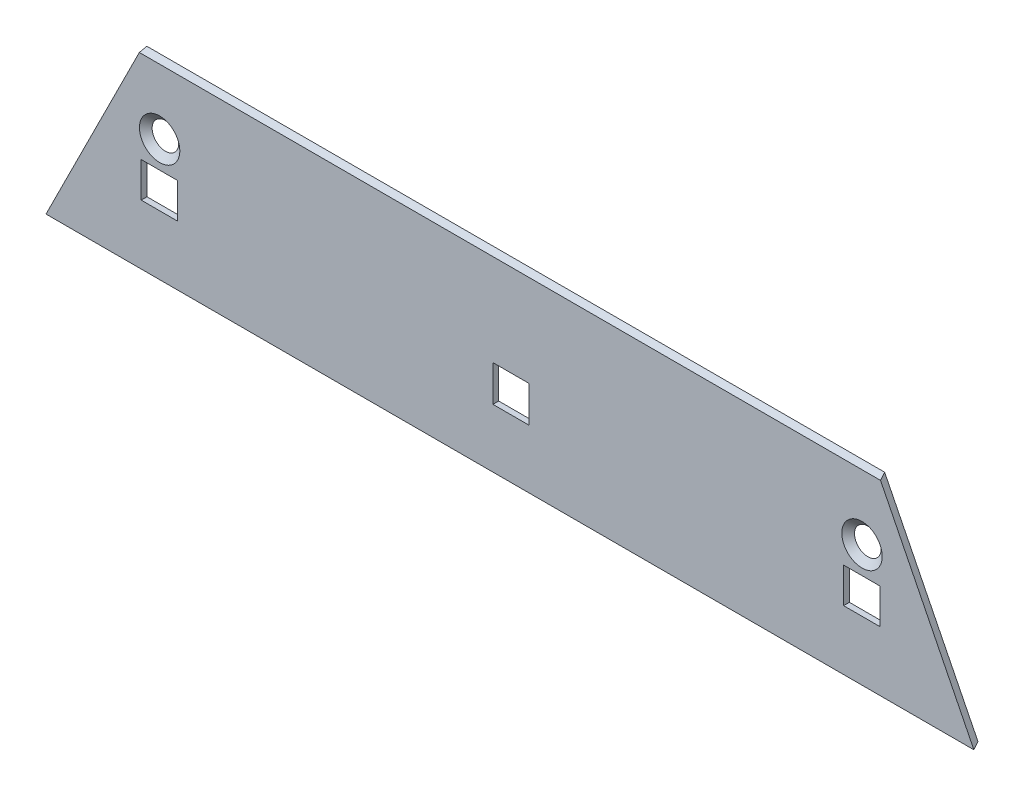
ISO-10303-21;
HEADER;
FILE_DESCRIPTION(('STEP AP214'),'2;1');
FILE_NAME('part.step','',(''),(''),'','','');
FILE_SCHEMA(('AUTOMOTIVE_DESIGN { 1 0 10303 214 1 1 1 1 }'));
ENDSEC;
DATA;
#1=APPLICATION_CONTEXT('core data for automotive mechanical design processes');
#2=APPLICATION_PROTOCOL_DEFINITION('international standard','automotive_design',2000,#1);
#3=PRODUCT_CONTEXT('',#1,'mechanical');
#4=PRODUCT('Part','Part','',(#3));
#5=PRODUCT_RELATED_PRODUCT_CATEGORY('part','',(#4));
#6=PRODUCT_DEFINITION_FORMATION('','',#4);
#7=PRODUCT_DEFINITION_CONTEXT('part definition',#1,'design');
#8=PRODUCT_DEFINITION('design','',#6,#7);
#9=PRODUCT_DEFINITION_SHAPE('','',#8);
#10=(LENGTH_UNIT() NAMED_UNIT(*) SI_UNIT(.MILLI.,.METRE.));
#11=(NAMED_UNIT(*) PLANE_ANGLE_UNIT() SI_UNIT($,.RADIAN.));
#12=(NAMED_UNIT(*) SI_UNIT($,.STERADIAN.) SOLID_ANGLE_UNIT());
#13=UNCERTAINTY_MEASURE_WITH_UNIT(LENGTH_MEASURE(1.E-05),#10,'distance_accuracy_value','');
#14=(GEOMETRIC_REPRESENTATION_CONTEXT(3) GLOBAL_UNCERTAINTY_ASSIGNED_CONTEXT((#13)) GLOBAL_UNIT_ASSIGNED_CONTEXT((#10,
#11,#12)) REPRESENTATION_CONTEXT('',''));
#15=CARTESIAN_POINT('',(0.,0.,0.));
#16=DIRECTION('',(0.,0.,1.));
#17=DIRECTION('',(1.,0.,0.));
#18=AXIS2_PLACEMENT_3D('',#15,#16,#17);
#19=CARTESIAN_POINT('',(162.814,-1.33086780534522,0.5715));
#20=DIRECTION('',(0.,0.,1.));
#21=DIRECTION('',(1.,0.,0.));
#22=AXIS2_PLACEMENT_3D('',#19,#20,#21);
#23=PLANE('',#22);
#24=CARTESIAN_POINT('',(19.9389999999997,19.426957216481,0.5715));
#25=DIRECTION('',(0.,0.,1.));
#26=DIRECTION('',(1.,0.,0.));
#27=AXIS2_PLACEMENT_3D('',#24,#25,#26);
#28=CIRCLE('',#27,2.33247834992428);
#29=CARTESIAN_POINT('',(22.271478349924,19.426957216481,0.5715));
#30=VERTEX_POINT('',#29);
#31=EDGE_CURVE('E314',#30,#30,#28,.T.);
#32=ORIENTED_EDGE('',*,*,#31,.T.);
#33=EDGE_LOOP('',(#32));
#34=FACE_BOUND('',#33,.T.);
#35=CARTESIAN_POINT('',(143.187406325167,19.426957216481,0.5715));
#36=DIRECTION('',(0.,0.,1.));
#37=DIRECTION('',(1.,0.,0.));
#38=AXIS2_PLACEMENT_3D('',#35,#36,#37);
#39=CIRCLE('',#38,2.33247834992428);
#40=CARTESIAN_POINT('',(145.519884675091,19.426957216481,0.5715));
#41=VERTEX_POINT('',#40);
#42=EDGE_CURVE('E168',#41,#41,#39,.T.);
#43=ORIENTED_EDGE('',*,*,#42,.T.);
#44=EDGE_LOOP('',(#43));
#45=FACE_BOUND('',#44,.T.);
#46=DIRECTION('',(-1.,0.,0.));
#47=VECTOR('',#46,1.);
#48=CARTESIAN_POINT('',(78.4186968374164,14.7279572164811,0.5715));
#49=LINE('',#48,#47);
#50=CARTESIAN_POINT('',(84.7686968374164,14.7279572164811,0.5715));
#51=VERTEX_POINT('',#50);
#52=CARTESIAN_POINT('',(78.4186968374164,14.7279572164811,0.5715));
#53=VERTEX_POINT('',#52);
#54=EDGE_CURVE('E153',#51,#53,#49,.T.);
#55=ORIENTED_EDGE('',*,*,#54,.T.);
#56=DIRECTION('',(0.,-1.,0.));
#57=VECTOR('',#56,1.);
#58=CARTESIAN_POINT('',(78.4186968374164,14.7279572164811,0.5715));
#59=LINE('',#58,#57);
#60=CARTESIAN_POINT('',(78.4186968374164,8.37795721648112,0.5715));
#61=VERTEX_POINT('',#60);
#62=EDGE_CURVE('E147',#53,#61,#59,.T.);
#63=ORIENTED_EDGE('',*,*,#62,.T.);
#64=DIRECTION('',(1.,0.,0.));
#65=VECTOR('',#64,1.);
#66=CARTESIAN_POINT('',(78.4186968374164,8.37795721648112,0.5715));
#67=LINE('',#66,#65);
#68=CARTESIAN_POINT('',(84.7686968374164,8.37795721648111,0.5715));
#69=VERTEX_POINT('',#68);
#70=EDGE_CURVE('E156',#61,#69,#67,.T.);
#71=ORIENTED_EDGE('',*,*,#70,.T.);
#72=DIRECTION('',(0.,1.,0.));
#73=VECTOR('',#72,1.);
#74=CARTESIAN_POINT('',(84.7686968374164,14.7279572164811,0.5715));
#75=LINE('',#74,#73);
#76=EDGE_CURVE('E48',#69,#51,#75,.T.);
#77=ORIENTED_EDGE('',*,*,#76,.T.);
#78=EDGE_LOOP('',(#55,#63,#71,#77));
#79=FACE_BOUND('',#78,.T.);
#80=DIRECTION('',(-1.,0.,0.));
#81=VECTOR('',#80,1.);
#82=CARTESIAN_POINT('',(139.954,14.7279572164811,0.5715));
#83=LINE('',#82,#81);
#84=CARTESIAN_POINT('',(146.304,14.7279572164811,0.5715));
#85=VERTEX_POINT('',#84);
#86=CARTESIAN_POINT('',(139.954,14.7279572164811,0.5715));
#87=VERTEX_POINT('',#86);
#88=EDGE_CURVE('E194',#85,#87,#83,.T.);
#89=ORIENTED_EDGE('',*,*,#88,.T.);
#90=DIRECTION('',(0.,-1.,0.));
#91=VECTOR('',#90,1.);
#92=CARTESIAN_POINT('',(139.954,14.7279572164811,0.5715));
#93=LINE('',#92,#91);
#94=CARTESIAN_POINT('',(139.954,8.55575721648109,0.5715));
#95=VERTEX_POINT('',#94);
#96=EDGE_CURVE('E184',#87,#95,#93,.T.);
#97=ORIENTED_EDGE('',*,*,#96,.T.);
#98=DIRECTION('',(1.,0.,0.));
#99=VECTOR('',#98,1.);
#100=CARTESIAN_POINT('',(139.954,8.55575721648109,0.5715));
#101=LINE('',#100,#99);
#102=CARTESIAN_POINT('',(146.304,8.55575721648109,0.5715));
#103=VERTEX_POINT('',#102);
#104=EDGE_CURVE('E187',#95,#103,#101,.T.);
#105=ORIENTED_EDGE('',*,*,#104,.T.);
#106=DIRECTION('',(0.,1.,0.));
#107=VECTOR('',#106,1.);
#108=CARTESIAN_POINT('',(146.304,14.7279572164811,0.5715));
#109=LINE('',#108,#107);
#110=EDGE_CURVE('E191',#103,#85,#109,.T.);
#111=ORIENTED_EDGE('',*,*,#110,.T.);
#112=EDGE_LOOP('',(#89,#97,#105,#111));
#113=FACE_BOUND('',#112,.T.);
#114=DIRECTION('',(-1.,0.,0.));
#115=VECTOR('',#114,1.);
#116=CARTESIAN_POINT('',(16.705593674833,14.7279572164811,0.5715));
#117=LINE('',#116,#115);
#118=CARTESIAN_POINT('',(23.055593674833,14.7279572164811,0.5715));
#119=VERTEX_POINT('',#118);
#120=CARTESIAN_POINT('',(16.705593674833,14.7279572164811,0.5715));
#121=VERTEX_POINT('',#120);
#122=EDGE_CURVE('E226',#119,#121,#117,.T.);
#123=ORIENTED_EDGE('',*,*,#122,.T.);
#124=DIRECTION('',(0.,-1.,0.));
#125=VECTOR('',#124,1.);
#126=CARTESIAN_POINT('',(16.705593674833,14.7279572164811,0.5715));
#127=LINE('',#126,#125);
#128=CARTESIAN_POINT('',(16.705593674833,8.55575721648113,0.5715));
#129=VERTEX_POINT('',#128);
#130=EDGE_CURVE('E216',#121,#129,#127,.T.);
#131=ORIENTED_EDGE('',*,*,#130,.T.);
#132=DIRECTION('',(1.,0.,0.));
#133=VECTOR('',#132,1.);
#134=CARTESIAN_POINT('',(16.705593674833,8.55575721648113,0.5715));
#135=LINE('',#134,#133);
#136=CARTESIAN_POINT('',(23.055593674833,8.55575721648113,0.5715));
#137=VERTEX_POINT('',#136);
#138=EDGE_CURVE('E219',#129,#137,#135,.T.);
#139=ORIENTED_EDGE('',*,*,#138,.T.);
#140=DIRECTION('',(0.,1.,0.));
#141=VECTOR('',#140,1.);
#142=CARTESIAN_POINT('',(23.055593674833,14.7279572164811,0.5715));
#143=LINE('',#142,#141);
#144=EDGE_CURVE('E223',#137,#119,#143,.T.);
#145=ORIENTED_EDGE('',*,*,#144,.T.);
#146=EDGE_LOOP('',(#123,#131,#139,#145));
#147=FACE_BOUND('',#146,.T.);
#148=DIRECTION('',(-1.,0.,0.));
#149=VECTOR('',#148,1.);
#150=CARTESIAN_POINT('',(162.814,31.4200443211581,0.5715));
#151=LINE('',#150,#149);
#152=CARTESIAN_POINT('',(146.141650509094,31.4200443211581,0.5715));
#153=VERTEX_POINT('',#152);
#154=CARTESIAN_POINT('',(16.6723494909062,31.4200443211581,0.5715));
#155=VERTEX_POINT('',#154);
#156=EDGE_CURVE('E11',#153,#155,#151,.T.);
#157=ORIENTED_EDGE('',*,*,#156,.F.);
#158=DIRECTION('',(0.447290848418704,-0.894388560370086,0.));
#159=VECTOR('',#158,1.);
#160=CARTESIAN_POINT('',(162.814,-1.91745567884188,0.5715));
#161=LINE('',#160,#159);
#162=CARTESIAN_POINT('',(162.520642728637,-1.33086780534522,0.5715));
#163=VERTEX_POINT('',#162);
#164=EDGE_CURVE('E248',#153,#163,#161,.T.);
#165=ORIENTED_EDGE('',*,*,#164,.T.);
#166=DIRECTION('',(-1.,0.,0.));
#167=VECTOR('',#166,1.);
#168=CARTESIAN_POINT('',(162.814,-1.33086780534522,0.5715));
#169=LINE('',#168,#167);
#170=CARTESIAN_POINT('',(0.293357271362982,-1.33086780534522,0.5715));
#171=VERTEX_POINT('',#170);
#172=EDGE_CURVE('E270',#163,#171,#169,.T.);
#173=ORIENTED_EDGE('',*,*,#172,.T.);
#174=DIRECTION('',(0.447290848418704,0.894388560370086,0.));
#175=VECTOR('',#174,1.);
#176=CARTESIAN_POINT('',(0.,-1.91745567884188,0.5715));
#177=LINE('',#176,#175);
#178=EDGE_CURVE('E259',#171,#155,#177,.T.);
#179=ORIENTED_EDGE('',*,*,#178,.T.);
#180=EDGE_LOOP('',(#157,#165,#173,#179));
#181=FACE_BOUND('',#180,.T.);
#182=ADVANCED_FACE('F34',(#34,#45,#79,#113,#147,#181),#23,.F.);
#183=CARTESIAN_POINT('',(162.814,31.4200443211581,0.5715));
#184=DIRECTION('',(0.,-0.866025403784435,-0.500000000000006));
#185=DIRECTION('',(0.,0.500000000000006,-0.866025403784435));
#186=AXIS2_PLACEMENT_3D('',#183,#184,#185);
#187=PLANE('',#186);
#188=DIRECTION('',(-1.,0.,0.));
#189=VECTOR('',#188,1.);
#190=CARTESIAN_POINT('',(162.814,30.8334564476615,1.5875));
#191=LINE('',#190,#189);
#192=CARTESIAN_POINT('',(146.435007780457,30.8334564476614,1.5875));
#193=VERTEX_POINT('',#192);
#194=CARTESIAN_POINT('',(16.3789922195432,30.8334564476615,1.5875));
#195=VERTEX_POINT('',#194);
#196=EDGE_CURVE('E41',#193,#195,#191,.T.);
#197=ORIENTED_EDGE('',*,*,#196,.F.);
#198=DIRECTION('',(-0.242584917028732,0.485065087908362,-0.840157377235133));
#199=VECTOR('',#198,1.);
#200=CARTESIAN_POINT('',(147.122775628261,29.4582177244887,3.96948334107133));
#201=LINE('',#200,#199);
#202=EDGE_CURVE('E255',#193,#153,#201,.T.);
#203=ORIENTED_EDGE('',*,*,#202,.T.);
#204=ORIENTED_EDGE('',*,*,#156,.T.);
#205=DIRECTION('',(-0.242584917028732,-0.485065087908362,0.840157377235133));
#206=VECTOR('',#205,1.);
#207=CARTESIAN_POINT('',(25.2724117886163,48.6164554812222,-29.213557837075));
#208=LINE('',#207,#206);
#209=EDGE_CURVE('E267',#155,#195,#208,.T.);
#210=ORIENTED_EDGE('',*,*,#209,.T.);
#211=EDGE_LOOP('',(#197,#203,#204,#210));
#212=FACE_BOUND('',#211,.T.);
#213=ADVANCED_FACE('F285',(#212),#187,.F.);
#214=CARTESIAN_POINT('',(162.814,-1.91745567884188,1.5875));
#215=DIRECTION('',(0.,0.,-1.));
#216=DIRECTION('',(0.,1.,0.));
#217=AXIS2_PLACEMENT_3D('',#214,#215,#216);
#218=PLANE('',#217);
#219=CARTESIAN_POINT('',(19.9389999999997,19.426957216481,1.5875));
#220=DIRECTION('',(0.,0.,1.));
#221=DIRECTION('',(1.,0.,0.));
#222=AXIS2_PLACEMENT_3D('',#219,#220,#221);
#223=CIRCLE('',#222,3.5433);
#224=CARTESIAN_POINT('',(23.4822999999997,19.426957216481,1.5875));
#225=VERTEX_POINT('',#224);
#226=EDGE_CURVE('E322',#225,#225,#223,.T.);
#227=ORIENTED_EDGE('',*,*,#226,.F.);
#228=EDGE_LOOP('',(#227));
#229=FACE_BOUND('',#228,.T.);
#230=CARTESIAN_POINT('',(143.187406325167,19.426957216481,1.5875));
#231=DIRECTION('',(0.,0.,1.));
#232=DIRECTION('',(1.,0.,0.));
#233=AXIS2_PLACEMENT_3D('',#230,#231,#232);
#234=CIRCLE('',#233,3.5433);
#235=CARTESIAN_POINT('',(146.730706325167,19.426957216481,1.5875));
#236=VERTEX_POINT('',#235);
#237=EDGE_CURVE('E318',#236,#236,#234,.T.);
#238=ORIENTED_EDGE('',*,*,#237,.F.);
#239=EDGE_LOOP('',(#238));
#240=FACE_BOUND('',#239,.T.);
#241=DIRECTION('',(1.,0.,0.));
#242=VECTOR('',#241,1.);
#243=CARTESIAN_POINT('',(78.4186968374164,8.37795721648112,1.5875));
#244=LINE('',#243,#242);
#245=CARTESIAN_POINT('',(78.4186968374164,8.37795721648112,1.5875));
#246=VERTEX_POINT('',#245);
#247=CARTESIAN_POINT('',(84.7686968374164,8.37795721648111,1.5875));
#248=VERTEX_POINT('',#247);
#249=EDGE_CURVE('E174',#246,#248,#244,.T.);
#250=ORIENTED_EDGE('',*,*,#249,.F.);
#251=DIRECTION('',(0.,-1.,0.));
#252=VECTOR('',#251,1.);
#253=CARTESIAN_POINT('',(78.4186968374164,14.7279572164811,1.5875));
#254=LINE('',#253,#252);
#255=CARTESIAN_POINT('',(78.4186968374164,14.7279572164811,1.5875));
#256=VERTEX_POINT('',#255);
#257=EDGE_CURVE('E56',#256,#246,#254,.T.);
#258=ORIENTED_EDGE('',*,*,#257,.F.);
#259=DIRECTION('',(-1.,0.,0.));
#260=VECTOR('',#259,1.);
#261=CARTESIAN_POINT('',(78.4186968374164,14.7279572164811,1.5875));
#262=LINE('',#261,#260);
#263=CARTESIAN_POINT('',(84.7686968374164,14.7279572164811,1.5875));
#264=VERTEX_POINT('',#263);
#265=EDGE_CURVE('E162',#264,#256,#262,.T.);
#266=ORIENTED_EDGE('',*,*,#265,.F.);
#267=DIRECTION('',(0.,1.,0.));
#268=VECTOR('',#267,1.);
#269=CARTESIAN_POINT('',(84.7686968374164,14.7279572164811,1.5875));
#270=LINE('',#269,#268);
#271=EDGE_CURVE('E165',#248,#264,#270,.T.);
#272=ORIENTED_EDGE('',*,*,#271,.F.);
#273=EDGE_LOOP('',(#250,#258,#266,#272));
#274=FACE_BOUND('',#273,.T.);
#275=DIRECTION('',(1.,0.,0.));
#276=VECTOR('',#275,1.);
#277=CARTESIAN_POINT('',(139.954,8.55575721648109,1.5875));
#278=LINE('',#277,#276);
#279=CARTESIAN_POINT('',(139.954,8.55575721648109,1.5875));
#280=VERTEX_POINT('',#279);
#281=CARTESIAN_POINT('',(146.304,8.55575721648109,1.5875));
#282=VERTEX_POINT('',#281);
#283=EDGE_CURVE('E199',#280,#282,#278,.T.);
#284=ORIENTED_EDGE('',*,*,#283,.F.);
#285=DIRECTION('',(0.,-1.,0.));
#286=VECTOR('',#285,1.);
#287=CARTESIAN_POINT('',(139.954,14.7279572164811,1.5875));
#288=LINE('',#287,#286);
#289=CARTESIAN_POINT('',(139.954,14.7279572164811,1.5875));
#290=VERTEX_POINT('',#289);
#291=EDGE_CURVE('E180',#290,#280,#288,.T.);
#292=ORIENTED_EDGE('',*,*,#291,.F.);
#293=DIRECTION('',(-1.,0.,0.));
#294=VECTOR('',#293,1.);
#295=CARTESIAN_POINT('',(139.954,14.7279572164811,1.5875));
#296=LINE('',#295,#294);
#297=CARTESIAN_POINT('',(146.304,14.7279572164811,1.5875));
#298=VERTEX_POINT('',#297);
#299=EDGE_CURVE('E188',#298,#290,#296,.T.);
#300=ORIENTED_EDGE('',*,*,#299,.F.);
#301=DIRECTION('',(0.,1.,0.));
#302=VECTOR('',#301,1.);
#303=CARTESIAN_POINT('',(146.304,14.7279572164811,1.5875));
#304=LINE('',#303,#302);
#305=EDGE_CURVE('E202',#282,#298,#304,.T.);
#306=ORIENTED_EDGE('',*,*,#305,.F.);
#307=EDGE_LOOP('',(#284,#292,#300,#306));
#308=FACE_BOUND('',#307,.T.);
#309=DIRECTION('',(1.,0.,0.));
#310=VECTOR('',#309,1.);
#311=CARTESIAN_POINT('',(16.705593674833,8.55575721648113,1.5875));
#312=LINE('',#311,#310);
#313=CARTESIAN_POINT('',(16.705593674833,8.55575721648113,1.5875));
#314=VERTEX_POINT('',#313);
#315=CARTESIAN_POINT('',(23.055593674833,8.55575721648113,1.5875));
#316=VERTEX_POINT('',#315);
#317=EDGE_CURVE('E231',#314,#316,#312,.T.);
#318=ORIENTED_EDGE('',*,*,#317,.F.);
#319=DIRECTION('',(0.,-1.,0.));
#320=VECTOR('',#319,1.);
#321=CARTESIAN_POINT('',(16.705593674833,14.7279572164811,1.5875));
#322=LINE('',#321,#320);
#323=CARTESIAN_POINT('',(16.705593674833,14.7279572164811,1.5875));
#324=VERTEX_POINT('',#323);
#325=EDGE_CURVE('E209',#324,#314,#322,.T.);
#326=ORIENTED_EDGE('',*,*,#325,.F.);
#327=DIRECTION('',(-1.,0.,0.));
#328=VECTOR('',#327,1.);
#329=CARTESIAN_POINT('',(16.705593674833,14.7279572164811,1.5875));
#330=LINE('',#329,#328);
#331=CARTESIAN_POINT('',(23.055593674833,14.7279572164811,1.5875));
#332=VERTEX_POINT('',#331);
#333=EDGE_CURVE('E220',#332,#324,#330,.T.);
#334=ORIENTED_EDGE('',*,*,#333,.F.);
#335=DIRECTION('',(0.,1.,0.));
#336=VECTOR('',#335,1.);
#337=CARTESIAN_POINT('',(23.055593674833,14.7279572164811,1.5875));
#338=LINE('',#337,#336);
#339=EDGE_CURVE('E234',#316,#332,#338,.T.);
#340=ORIENTED_EDGE('',*,*,#339,.F.);
#341=EDGE_LOOP('',(#318,#326,#334,#340));
#342=FACE_BOUND('',#341,.T.);
#343=DIRECTION('',(-1.,0.,0.));
#344=VECTOR('',#343,1.);
#345=CARTESIAN_POINT('',(162.814,-1.91745567884188,1.5875));
#346=LINE('',#345,#344);
#347=CARTESIAN_POINT('',(162.814,-1.91745567884188,1.5875));
#348=VERTEX_POINT('',#347);
#349=CARTESIAN_POINT('',(0.,-1.91745567884188,1.5875));
#350=VERTEX_POINT('',#349);
#351=EDGE_CURVE('E272',#348,#350,#346,.T.);
#352=ORIENTED_EDGE('',*,*,#351,.F.);
#353=DIRECTION('',(0.447290848418704,-0.894388560370086,0.));
#354=VECTOR('',#353,1.);
#355=CARTESIAN_POINT('',(162.814,-1.91745567884188,1.5875));
#356=LINE('',#355,#354);
#357=EDGE_CURVE('E241',#193,#348,#356,.T.);
#358=ORIENTED_EDGE('',*,*,#357,.F.);
#359=ORIENTED_EDGE('',*,*,#196,.T.);
#360=DIRECTION('',(0.447290848418704,0.894388560370086,0.));
#361=VECTOR('',#360,1.);
#362=CARTESIAN_POINT('',(0.,-1.91745567884188,1.5875));
#363=LINE('',#362,#361);
#364=EDGE_CURVE('E258',#350,#195,#363,.T.);
#365=ORIENTED_EDGE('',*,*,#364,.F.);
#366=EDGE_LOOP('',(#352,#358,#359,#365));
#367=FACE_BOUND('',#366,.T.);
#368=ADVANCED_FACE('F279',(#229,#240,#274,#308,#342,#367),#218,.F.);
#369=CARTESIAN_POINT('',(162.814,-1.91745567884188,1.5875));
#370=DIRECTION('',(0.,0.86602540378444,0.499999999999998));
#371=DIRECTION('',(0.,-0.499999999999998,0.86602540378444));
#372=AXIS2_PLACEMENT_3D('',#369,#370,#371);
#373=PLANE('',#372);
#374=ORIENTED_EDGE('',*,*,#172,.F.);
#375=DIRECTION('',(0.242584917028728,-0.485065087908354,0.840157377235138));
#376=VECTOR('',#375,1.);
#377=CARTESIAN_POINT('',(162.814,-1.91745567884188,1.5875));
#378=LINE('',#377,#376);
#379=EDGE_CURVE('E251',#163,#348,#378,.T.);
#380=ORIENTED_EDGE('',*,*,#379,.T.);
#381=ORIENTED_EDGE('',*,*,#351,.T.);
#382=DIRECTION('',(0.242584917028728,0.485065087908354,-0.840157377235138));
#383=VECTOR('',#382,1.);
#384=CARTESIAN_POINT('',(9.58118741687672,17.2407820778911,-31.5955411781461));
#385=LINE('',#384,#383);
#386=EDGE_CURVE('E262',#350,#171,#385,.T.);
#387=ORIENTED_EDGE('',*,*,#386,.T.);
#388=EDGE_LOOP('',(#374,#380,#381,#387));
#389=FACE_BOUND('',#388,.T.);
#390=ADVANCED_FACE('F290',(#389),#373,.F.);
#391=CARTESIAN_POINT('',(0.,-1.91745567884188,0.5715));
#392=DIRECTION('',(0.894388560370086,-0.447290848418704,0.));
#393=DIRECTION('',(0.447290848418704,0.894388560370086,0.));
#394=AXIS2_PLACEMENT_3D('',#391,#392,#393);
#395=PLANE('',#394);
#396=ORIENTED_EDGE('',*,*,#178,.F.);
#397=ORIENTED_EDGE('',*,*,#386,.F.);
#398=ORIENTED_EDGE('',*,*,#364,.T.);
#399=ORIENTED_EDGE('',*,*,#209,.F.);
#400=EDGE_LOOP('',(#396,#397,#398,#399));
#401=FACE_BOUND('',#400,.T.);
#402=ADVANCED_FACE('F284',(#401),#395,.F.);
#403=CARTESIAN_POINT('',(162.814,-1.91745567884188,0.5715));
#404=DIRECTION('',(-0.894388560370087,-0.447290848418704,0.));
#405=DIRECTION('',(0.447290848418704,-0.894388560370087,0.));
#406=AXIS2_PLACEMENT_3D('',#403,#404,#405);
#407=PLANE('',#406);
#408=ORIENTED_EDGE('',*,*,#357,.T.);
#409=ORIENTED_EDGE('',*,*,#379,.F.);
#410=ORIENTED_EDGE('',*,*,#164,.F.);
#411=ORIENTED_EDGE('',*,*,#202,.F.);
#412=EDGE_LOOP('',(#408,#409,#410,#411));
#413=FACE_BOUND('',#412,.T.);
#414=ADVANCED_FACE('F292',(#413),#407,.F.);
#415=CARTESIAN_POINT('',(16.705593674833,14.7279572164811,0.5715));
#416=DIRECTION('',(-1.,0.,0.));
#417=DIRECTION('',(0.,0.,1.));
#418=AXIS2_PLACEMENT_3D('',#415,#416,#417);
#419=PLANE('',#418);
#420=ORIENTED_EDGE('',*,*,#325,.T.);
#421=DIRECTION('',(0.,0.,1.));
#422=VECTOR('',#421,1.);
#423=CARTESIAN_POINT('',(16.705593674833,8.55575721648113,0.5715));
#424=LINE('',#423,#422);
#425=EDGE_CURVE('E229',#129,#314,#424,.T.);
#426=ORIENTED_EDGE('',*,*,#425,.F.);
#427=ORIENTED_EDGE('',*,*,#130,.F.);
#428=DIRECTION('',(0.,0.,1.));
#429=VECTOR('',#428,1.);
#430=CARTESIAN_POINT('',(16.705593674833,14.7279572164811,0.5715));
#431=LINE('',#430,#429);
#432=EDGE_CURVE('E239',#121,#324,#431,.T.);
#433=ORIENTED_EDGE('',*,*,#432,.T.);
#434=EDGE_LOOP('',(#420,#426,#427,#433));
#435=FACE_BOUND('',#434,.T.);
#436=ADVANCED_FACE('F294',(#435),#419,.F.);
#437=CARTESIAN_POINT('',(16.705593674833,14.7279572164811,0.5715));
#438=DIRECTION('',(0.,1.,0.));
#439=DIRECTION('',(0.,0.,1.));
#440=AXIS2_PLACEMENT_3D('',#437,#438,#439);
#441=PLANE('',#440);
#442=ORIENTED_EDGE('',*,*,#333,.T.);
#443=ORIENTED_EDGE('',*,*,#432,.F.);
#444=ORIENTED_EDGE('',*,*,#122,.F.);
#445=DIRECTION('',(0.,0.,1.));
#446=VECTOR('',#445,1.);
#447=CARTESIAN_POINT('',(23.055593674833,14.7279572164811,0.5715));
#448=LINE('',#447,#446);
#449=EDGE_CURVE('E242',#119,#332,#448,.T.);
#450=ORIENTED_EDGE('',*,*,#449,.T.);
#451=EDGE_LOOP('',(#442,#443,#444,#450));
#452=FACE_BOUND('',#451,.T.);
#453=ADVANCED_FACE('F300',(#452),#441,.F.);
#454=CARTESIAN_POINT('',(23.055593674833,14.7279572164811,0.5715));
#455=DIRECTION('',(1.,0.,0.));
#456=DIRECTION('',(0.,1.,0.));
#457=AXIS2_PLACEMENT_3D('',#454,#455,#456);
#458=PLANE('',#457);
#459=ORIENTED_EDGE('',*,*,#339,.T.);
#460=ORIENTED_EDGE('',*,*,#449,.F.);
#461=ORIENTED_EDGE('',*,*,#144,.F.);
#462=DIRECTION('',(0.,0.,1.));
#463=VECTOR('',#462,1.);
#464=CARTESIAN_POINT('',(23.055593674833,8.55575721648113,0.5715));
#465=LINE('',#464,#463);
#466=EDGE_CURVE('E244',#137,#316,#465,.T.);
#467=ORIENTED_EDGE('',*,*,#466,.T.);
#468=EDGE_LOOP('',(#459,#460,#461,#467));
#469=FACE_BOUND('',#468,.T.);
#470=ADVANCED_FACE('F352',(#469),#458,.F.);
#471=CARTESIAN_POINT('',(16.705593674833,8.55575721648113,0.5715));
#472=DIRECTION('',(0.,-1.,0.));
#473=DIRECTION('',(0.,0.,-1.));
#474=AXIS2_PLACEMENT_3D('',#471,#472,#473);
#475=PLANE('',#474);
#476=ORIENTED_EDGE('',*,*,#317,.T.);
#477=ORIENTED_EDGE('',*,*,#466,.F.);
#478=ORIENTED_EDGE('',*,*,#138,.F.);
#479=ORIENTED_EDGE('',*,*,#425,.T.);
#480=EDGE_LOOP('',(#476,#477,#478,#479));
#481=FACE_BOUND('',#480,.T.);
#482=ADVANCED_FACE('F346',(#481),#475,.F.);
#483=CARTESIAN_POINT('',(139.954,14.7279572164811,0.5715));
#484=DIRECTION('',(-1.,0.,0.));
#485=DIRECTION('',(0.,0.,1.));
#486=AXIS2_PLACEMENT_3D('',#483,#484,#485);
#487=PLANE('',#486);
#488=ORIENTED_EDGE('',*,*,#291,.T.);
#489=DIRECTION('',(0.,0.,1.));
#490=VECTOR('',#489,1.);
#491=CARTESIAN_POINT('',(139.954,8.55575721648109,0.5715));
#492=LINE('',#491,#490);
#493=EDGE_CURVE('E197',#95,#280,#492,.T.);
#494=ORIENTED_EDGE('',*,*,#493,.F.);
#495=ORIENTED_EDGE('',*,*,#96,.F.);
#496=DIRECTION('',(0.,0.,1.));
#497=VECTOR('',#496,1.);
#498=CARTESIAN_POINT('',(139.954,14.7279572164811,0.5715));
#499=LINE('',#498,#497);
#500=EDGE_CURVE('E207',#87,#290,#499,.T.);
#501=ORIENTED_EDGE('',*,*,#500,.T.);
#502=EDGE_LOOP('',(#488,#494,#495,#501));
#503=FACE_BOUND('',#502,.T.);
#504=ADVANCED_FACE('F360',(#503),#487,.F.);
#505=CARTESIAN_POINT('',(139.954,14.7279572164811,0.5715));
#506=DIRECTION('',(0.,1.,0.));
#507=DIRECTION('',(0.,0.,1.));
#508=AXIS2_PLACEMENT_3D('',#505,#506,#507);
#509=PLANE('',#508);
#510=ORIENTED_EDGE('',*,*,#299,.T.);
#511=ORIENTED_EDGE('',*,*,#500,.F.);
#512=ORIENTED_EDGE('',*,*,#88,.F.);
#513=DIRECTION('',(0.,0.,1.));
#514=VECTOR('',#513,1.);
#515=CARTESIAN_POINT('',(146.304,14.7279572164811,0.5715));
#516=LINE('',#515,#514);
#517=EDGE_CURVE('E210',#85,#298,#516,.T.);
#518=ORIENTED_EDGE('',*,*,#517,.T.);
#519=EDGE_LOOP('',(#510,#511,#512,#518));
#520=FACE_BOUND('',#519,.T.);
#521=ADVANCED_FACE('F366',(#520),#509,.F.);
#522=CARTESIAN_POINT('',(146.304,14.7279572164811,0.5715));
#523=DIRECTION('',(1.,0.,0.));
#524=DIRECTION('',(0.,1.,0.));
#525=AXIS2_PLACEMENT_3D('',#522,#523,#524);
#526=PLANE('',#525);
#527=ORIENTED_EDGE('',*,*,#305,.T.);
#528=ORIENTED_EDGE('',*,*,#517,.F.);
#529=ORIENTED_EDGE('',*,*,#110,.F.);
#530=DIRECTION('',(0.,0.,1.));
#531=VECTOR('',#530,1.);
#532=CARTESIAN_POINT('',(146.304,8.55575721648109,0.5715));
#533=LINE('',#532,#531);
#534=EDGE_CURVE('E212',#103,#282,#533,.T.);
#535=ORIENTED_EDGE('',*,*,#534,.T.);
#536=EDGE_LOOP('',(#527,#528,#529,#535));
#537=FACE_BOUND('',#536,.T.);
#538=ADVANCED_FACE('F371',(#537),#526,.F.);
#539=CARTESIAN_POINT('',(139.954,8.55575721648109,0.5715));
#540=DIRECTION('',(0.,-1.,0.));
#541=DIRECTION('',(0.,0.,-1.));
#542=AXIS2_PLACEMENT_3D('',#539,#540,#541);
#543=PLANE('',#542);
#544=ORIENTED_EDGE('',*,*,#283,.T.);
#545=ORIENTED_EDGE('',*,*,#534,.F.);
#546=ORIENTED_EDGE('',*,*,#104,.F.);
#547=ORIENTED_EDGE('',*,*,#493,.T.);
#548=EDGE_LOOP('',(#544,#545,#546,#547));
#549=FACE_BOUND('',#548,.T.);
#550=ADVANCED_FACE('F368',(#549),#543,.F.);
#551=CARTESIAN_POINT('',(78.4186968374164,14.7279572164811,0.5715));
#552=DIRECTION('',(-1.,0.,0.));
#553=DIRECTION('',(0.,0.,1.));
#554=AXIS2_PLACEMENT_3D('',#551,#552,#553);
#555=PLANE('',#554);
#556=ORIENTED_EDGE('',*,*,#257,.T.);
#557=DIRECTION('',(0.,0.,1.));
#558=VECTOR('',#557,1.);
#559=CARTESIAN_POINT('',(78.4186968374164,8.37795721648112,0.5715));
#560=LINE('',#559,#558);
#561=EDGE_CURVE('E143',#61,#246,#560,.T.);
#562=ORIENTED_EDGE('',*,*,#561,.F.);
#563=ORIENTED_EDGE('',*,*,#62,.F.);
#564=DIRECTION('',(0.,0.,1.));
#565=VECTOR('',#564,1.);
#566=CARTESIAN_POINT('',(78.4186968374164,14.7279572164811,0.5715));
#567=LINE('',#566,#565);
#568=EDGE_CURVE('E178',#53,#256,#567,.T.);
#569=ORIENTED_EDGE('',*,*,#568,.T.);
#570=EDGE_LOOP('',(#556,#562,#563,#569));
#571=FACE_BOUND('',#570,.T.);
#572=ADVANCED_FACE('F145',(#571),#555,.F.);
#573=CARTESIAN_POINT('',(78.4186968374164,14.7279572164811,0.5715));
#574=DIRECTION('',(0.,1.,0.));
#575=DIRECTION('',(0.,0.,1.));
#576=AXIS2_PLACEMENT_3D('',#573,#574,#575);
#577=PLANE('',#576);
#578=ORIENTED_EDGE('',*,*,#265,.T.);
#579=ORIENTED_EDGE('',*,*,#568,.F.);
#580=ORIENTED_EDGE('',*,*,#54,.F.);
#581=DIRECTION('',(0.,0.,1.));
#582=VECTOR('',#581,1.);
#583=CARTESIAN_POINT('',(84.7686968374164,14.7279572164811,0.5715));
#584=LINE('',#583,#582);
#585=EDGE_CURVE('E181',#51,#264,#584,.T.);
#586=ORIENTED_EDGE('',*,*,#585,.T.);
#587=EDGE_LOOP('',(#578,#579,#580,#586));
#588=FACE_BOUND('',#587,.T.);
#589=ADVANCED_FACE('F381',(#588),#577,.F.);
#590=CARTESIAN_POINT('',(84.7686968374164,14.7279572164811,0.5715));
#591=DIRECTION('',(1.,0.,0.));
#592=DIRECTION('',(0.,0.,-1.));
#593=AXIS2_PLACEMENT_3D('',#590,#591,#592);
#594=PLANE('',#593);
#595=ORIENTED_EDGE('',*,*,#271,.T.);
#596=ORIENTED_EDGE('',*,*,#585,.F.);
#597=ORIENTED_EDGE('',*,*,#76,.F.);
#598=DIRECTION('',(0.,0.,1.));
#599=VECTOR('',#598,1.);
#600=CARTESIAN_POINT('',(84.7686968374164,8.37795721648111,0.5715));
#601=LINE('',#600,#599);
#602=EDGE_CURVE('E152',#69,#248,#601,.T.);
#603=ORIENTED_EDGE('',*,*,#602,.T.);
#604=EDGE_LOOP('',(#595,#596,#597,#603));
#605=FACE_BOUND('',#604,.T.);
#606=ADVANCED_FACE('F385',(#605),#594,.F.);
#607=CARTESIAN_POINT('',(78.4186968374164,8.37795721648112,0.5715));
#608=DIRECTION('',(0.,-1.,0.));
#609=DIRECTION('',(1.,0.,0.));
#610=AXIS2_PLACEMENT_3D('',#607,#608,#609);
#611=PLANE('',#610);
#612=ORIENTED_EDGE('',*,*,#249,.T.);
#613=ORIENTED_EDGE('',*,*,#602,.F.);
#614=ORIENTED_EDGE('',*,*,#70,.F.);
#615=ORIENTED_EDGE('',*,*,#561,.T.);
#616=EDGE_LOOP('',(#612,#613,#614,#615));
#617=FACE_BOUND('',#616,.T.);
#618=ADVANCED_FACE('F157',(#617),#611,.F.);
#619=CARTESIAN_POINT('',(143.187406325167,19.426957216481,1.5875));
#620=DIRECTION('',(0.,0.,1.));
#621=DIRECTION('',(1.,0.,0.));
#622=AXIS2_PLACEMENT_3D('',#619,#620,#621);
#623=CONICAL_SURFACE('',#622,3.5433,0.872664625997163);
#624=ORIENTED_EDGE('',*,*,#237,.T.);
#625=EDGE_LOOP('',(#624));
#626=FACE_BOUND('',#625,.T.);
#627=ORIENTED_EDGE('',*,*,#42,.F.);
#628=EDGE_LOOP('',(#627));
#629=FACE_BOUND('',#628,.T.);
#630=ADVANCED_FACE('F384',(#626,#629),#623,.F.);
#631=CARTESIAN_POINT('',(19.9389999999997,19.426957216481,1.5875));
#632=DIRECTION('',(0.,0.,1.));
#633=DIRECTION('',(1.,0.,0.));
#634=AXIS2_PLACEMENT_3D('',#631,#632,#633);
#635=CONICAL_SURFACE('',#634,3.5433,0.872664625997164);
#636=ORIENTED_EDGE('',*,*,#226,.T.);
#637=EDGE_LOOP('',(#636));
#638=FACE_BOUND('',#637,.T.);
#639=ORIENTED_EDGE('',*,*,#31,.F.);
#640=EDGE_LOOP('',(#639));
#641=FACE_BOUND('',#640,.T.);
#642=ADVANCED_FACE('F328',(#638,#641),#635,.F.);
#643=CLOSED_SHELL('',(#182,#213,#368,#390,#402,#414,#436,#453,#470,#482,#504,#521,#538,#550,
#572,#589,#606,#618,#630,#642));
#644=MANIFOLD_SOLID_BREP('B2',#643);
#645=ADVANCED_BREP_SHAPE_REPRESENTATION('',(#18,#644),#14);
#646=SHAPE_DEFINITION_REPRESENTATION(#9,#645);
ENDSEC;
END-ISO-10303-21;
